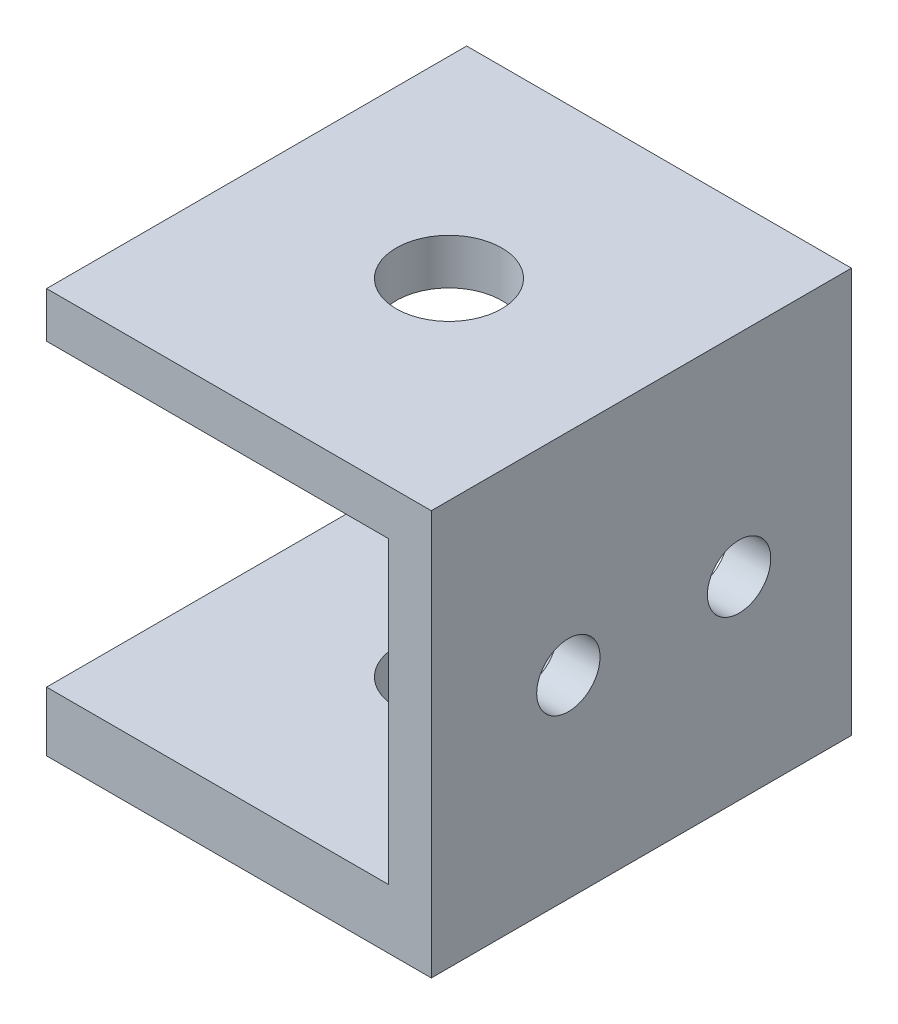
ISO-10303-21;
HEADER;
FILE_DESCRIPTION(('STEP AP214'),'2;1');
FILE_NAME('part.step','',(''),(''),'','','');
FILE_SCHEMA(('AUTOMOTIVE_DESIGN { 1 0 10303 214 1 1 1 1 }'));
ENDSEC;
DATA;
#1=APPLICATION_CONTEXT('core data for automotive mechanical design processes');
#2=APPLICATION_PROTOCOL_DEFINITION('international standard','automotive_design',2000,#1);
#3=PRODUCT_CONTEXT('',#1,'mechanical');
#4=PRODUCT('Part','Part','',(#3));
#5=PRODUCT_RELATED_PRODUCT_CATEGORY('part','',(#4));
#6=PRODUCT_DEFINITION_FORMATION('','',#4);
#7=PRODUCT_DEFINITION_CONTEXT('part definition',#1,'design');
#8=PRODUCT_DEFINITION('design','',#6,#7);
#9=PRODUCT_DEFINITION_SHAPE('','',#8);
#10=(LENGTH_UNIT() NAMED_UNIT(*) SI_UNIT(.MILLI.,.METRE.));
#11=(NAMED_UNIT(*) PLANE_ANGLE_UNIT() SI_UNIT($,.RADIAN.));
#12=(NAMED_UNIT(*) SI_UNIT($,.STERADIAN.) SOLID_ANGLE_UNIT());
#13=UNCERTAINTY_MEASURE_WITH_UNIT(LENGTH_MEASURE(1.E-05),#10,'distance_accuracy_value','');
#14=(GEOMETRIC_REPRESENTATION_CONTEXT(3) GLOBAL_UNCERTAINTY_ASSIGNED_CONTEXT((#13)) GLOBAL_UNIT_ASSIGNED_CONTEXT((#10,
#11,#12)) REPRESENTATION_CONTEXT('',''));
#15=CARTESIAN_POINT('',(0.,0.,0.));
#16=DIRECTION('',(0.,0.,1.));
#17=DIRECTION('',(1.,0.,0.));
#18=AXIS2_PLACEMENT_3D('',#15,#16,#17);
#19=CARTESIAN_POINT('',(0.,0.,50.));
#20=DIRECTION('',(1.,0.,0.));
#21=DIRECTION('',(0.,0.,-1.));
#22=AXIS2_PLACEMENT_3D('',#19,#20,#21);
#23=PLANE('',#22);
#24=DIRECTION('',(0.,-1.,0.));
#25=VECTOR('',#24,1.);
#26=CARTESIAN_POINT('',(0.,0.,0.));
#27=LINE('',#26,#25);
#28=CARTESIAN_POINT('',(0.,48.162822481859,0.));
#29=VERTEX_POINT('',#28);
#30=CARTESIAN_POINT('',(0.,42.7368445753196,0.));
#31=VERTEX_POINT('',#30);
#32=EDGE_CURVE('E132',#29,#31,#27,.T.);
#33=ORIENTED_EDGE('',*,*,#32,.T.);
#34=DIRECTION('',(0.,0.,1.));
#35=VECTOR('',#34,1.);
#36=CARTESIAN_POINT('',(0.,42.7368445753196,0.));
#37=LINE('',#36,#35);
#38=CARTESIAN_POINT('',(0.,42.7368445753196,50.));
#39=VERTEX_POINT('',#38);
#40=EDGE_CURVE('E133',#31,#39,#37,.T.);
#41=ORIENTED_EDGE('',*,*,#40,.T.);
#42=DIRECTION('',(0.,-1.,0.));
#43=VECTOR('',#42,1.);
#44=CARTESIAN_POINT('',(0.,0.,50.));
#45=LINE('',#44,#43);
#46=CARTESIAN_POINT('',(0.,48.162822481859,50.));
#47=VERTEX_POINT('',#46);
#48=EDGE_CURVE('E162',#47,#39,#45,.T.);
#49=ORIENTED_EDGE('',*,*,#48,.F.);
#50=DIRECTION('',(0.,0.,-1.));
#51=VECTOR('',#50,1.);
#52=CARTESIAN_POINT('',(0.,48.162822481859,50.));
#53=LINE('',#52,#51);
#54=EDGE_CURVE('E146',#47,#29,#53,.T.);
#55=ORIENTED_EDGE('',*,*,#54,.T.);
#56=EDGE_LOOP('',(#33,#41,#49,#55));
#57=FACE_BOUND('',#56,.T.);
#58=ADVANCED_FACE('F37',(#57),#23,.F.);
#59=CARTESIAN_POINT('',(0.,7.08707813494426,50.));
#60=VERTEX_POINT('',#59);
#61=CARTESIAN_POINT('',(0.,0.,50.));
#62=VERTEX_POINT('',#61);
#63=EDGE_CURVE('E90',#60,#62,#45,.T.);
#64=ORIENTED_EDGE('',*,*,#63,.F.);
#65=DIRECTION('',(0.,0.,1.));
#66=VECTOR('',#65,1.);
#67=CARTESIAN_POINT('',(0.,7.08707813494426,0.));
#68=LINE('',#67,#66);
#69=CARTESIAN_POINT('',(0.,7.08707813494426,0.));
#70=VERTEX_POINT('',#69);
#71=EDGE_CURVE('E116',#70,#60,#68,.T.);
#72=ORIENTED_EDGE('',*,*,#71,.F.);
#73=CARTESIAN_POINT('',(0.,0.,0.));
#74=VERTEX_POINT('',#73);
#75=EDGE_CURVE('E124',#70,#74,#27,.T.);
#76=ORIENTED_EDGE('',*,*,#75,.T.);
#77=DIRECTION('',(0.,0.,-1.));
#78=VECTOR('',#77,1.);
#79=CARTESIAN_POINT('',(0.,0.,50.));
#80=LINE('',#79,#78);
#81=EDGE_CURVE('E11',#62,#74,#80,.T.);
#82=ORIENTED_EDGE('',*,*,#81,.F.);
#83=EDGE_LOOP('',(#64,#72,#76,#82));
#84=FACE_BOUND('',#83,.T.);
#85=ADVANCED_FACE('F39',(#84),#23,.F.);
#86=CARTESIAN_POINT('',(0.,0.,50.));
#87=DIRECTION('',(0.,1.,0.));
#88=DIRECTION('',(0.,0.,1.));
#89=AXIS2_PLACEMENT_3D('',#86,#87,#88);
#90=PLANE('',#89);
#91=CARTESIAN_POINT('',(22.8955841722473,0.,25.));
#92=DIRECTION('',(0.,1.,0.));
#93=DIRECTION('',(0.,0.,1.));
#94=AXIS2_PLACEMENT_3D('',#91,#92,#93);
#95=CIRCLE('',#94,6.27714052911316);
#96=CARTESIAN_POINT('',(22.8955841722473,0.,31.2771405291132));
#97=VERTEX_POINT('',#96);
#98=EDGE_CURVE('E184',#97,#97,#95,.T.);
#99=ORIENTED_EDGE('',*,*,#98,.T.);
#100=EDGE_LOOP('',(#99));
#101=FACE_BOUND('',#100,.T.);
#102=DIRECTION('',(1.,0.,0.));
#103=VECTOR('',#102,1.);
#104=CARTESIAN_POINT('',(0.,0.,0.));
#105=LINE('',#104,#103);
#106=CARTESIAN_POINT('',(45.7911683444947,0.,0.));
#107=VERTEX_POINT('',#106);
#108=EDGE_CURVE('E131',#74,#107,#105,.T.);
#109=ORIENTED_EDGE('',*,*,#108,.T.);
#110=DIRECTION('',(0.,0.,-1.));
#111=VECTOR('',#110,1.);
#112=CARTESIAN_POINT('',(45.7911683444947,0.,50.));
#113=LINE('',#112,#111);
#114=CARTESIAN_POINT('',(45.7911683444947,0.,50.));
#115=VERTEX_POINT('',#114);
#116=EDGE_CURVE('E46',#115,#107,#113,.T.);
#117=ORIENTED_EDGE('',*,*,#116,.F.);
#118=DIRECTION('',(1.,0.,0.));
#119=VECTOR('',#118,1.);
#120=CARTESIAN_POINT('',(0.,0.,50.));
#121=LINE('',#120,#119);
#122=EDGE_CURVE('E164',#62,#115,#121,.T.);
#123=ORIENTED_EDGE('',*,*,#122,.F.);
#124=ORIENTED_EDGE('',*,*,#81,.T.);
#125=EDGE_LOOP('',(#109,#117,#123,#124));
#126=FACE_BOUND('',#125,.T.);
#127=ADVANCED_FACE('F231',(#101,#126),#90,.F.);
#128=CARTESIAN_POINT('',(45.7911683444947,0.,50.));
#129=DIRECTION('',(-1.,0.,0.));
#130=DIRECTION('',(0.,0.,1.));
#131=AXIS2_PLACEMENT_3D('',#128,#129,#130);
#132=PLANE('',#131);
#133=CARTESIAN_POINT('',(45.7911683444947,23.0591957157573,13.3722984011679));
#134=DIRECTION('',(-1.,0.,0.));
#135=DIRECTION('',(0.,0.,1.));
#136=AXIS2_PLACEMENT_3D('',#133,#134,#135);
#137=CIRCLE('',#136,3.76941974907196);
#138=CARTESIAN_POINT('',(45.7911683444947,23.0591957157573,17.1417181502398));
#139=VERTEX_POINT('',#138);
#140=EDGE_CURVE('E185',#139,#139,#137,.T.);
#141=ORIENTED_EDGE('',*,*,#140,.T.);
#142=EDGE_LOOP('',(#141));
#143=FACE_BOUND('',#142,.T.);
#144=CARTESIAN_POINT('',(45.7911683444947,23.0591957157573,33.6888319639625));
#145=DIRECTION('',(-1.,0.,0.));
#146=DIRECTION('',(0.,0.,1.));
#147=AXIS2_PLACEMENT_3D('',#144,#145,#146);
#148=CIRCLE('',#147,3.76941974907196);
#149=CARTESIAN_POINT('',(45.7911683444947,23.0591957157573,37.4582517130344));
#150=VERTEX_POINT('',#149);
#151=EDGE_CURVE('E191',#150,#150,#148,.T.);
#152=ORIENTED_EDGE('',*,*,#151,.T.);
#153=EDGE_LOOP('',(#152));
#154=FACE_BOUND('',#153,.T.);
#155=DIRECTION('',(0.,1.,0.));
#156=VECTOR('',#155,1.);
#157=CARTESIAN_POINT('',(45.7911683444947,0.,0.));
#158=LINE('',#157,#156);
#159=CARTESIAN_POINT('',(45.7911683444947,48.162822481859,0.));
#160=VERTEX_POINT('',#159);
#161=EDGE_CURVE('E143',#107,#160,#158,.T.);
#162=ORIENTED_EDGE('',*,*,#161,.T.);
#163=DIRECTION('',(0.,0.,-1.));
#164=VECTOR('',#163,1.);
#165=CARTESIAN_POINT('',(45.7911683444947,48.162822481859,50.));
#166=LINE('',#165,#164);
#167=CARTESIAN_POINT('',(45.7911683444947,48.162822481859,50.));
#168=VERTEX_POINT('',#167);
#169=EDGE_CURVE('E148',#168,#160,#166,.T.);
#170=ORIENTED_EDGE('',*,*,#169,.F.);
#171=DIRECTION('',(0.,1.,0.));
#172=VECTOR('',#171,1.);
#173=CARTESIAN_POINT('',(45.7911683444947,0.,50.));
#174=LINE('',#173,#172);
#175=EDGE_CURVE('E156',#115,#168,#174,.T.);
#176=ORIENTED_EDGE('',*,*,#175,.F.);
#177=ORIENTED_EDGE('',*,*,#116,.T.);
#178=EDGE_LOOP('',(#162,#170,#176,#177));
#179=FACE_BOUND('',#178,.T.);
#180=ADVANCED_FACE('F154',(#143,#154,#179),#132,.F.);
#181=CARTESIAN_POINT('',(0.,48.162822481859,50.));
#182=DIRECTION('',(0.,-1.,0.));
#183=DIRECTION('',(0.,0.,-1.));
#184=AXIS2_PLACEMENT_3D('',#181,#182,#183);
#185=PLANE('',#184);
#186=CARTESIAN_POINT('',(22.8955841722473,48.162822481859,25.));
#187=DIRECTION('',(0.,1.,0.));
#188=DIRECTION('',(0.,0.,1.));
#189=AXIS2_PLACEMENT_3D('',#186,#187,#188);
#190=CIRCLE('',#189,6.27714052911316);
#191=CARTESIAN_POINT('',(22.8955841722473,48.162822481859,31.2771405291132));
#192=VERTEX_POINT('',#191);
#193=EDGE_CURVE('E181',#192,#192,#190,.T.);
#194=ORIENTED_EDGE('',*,*,#193,.F.);
#195=EDGE_LOOP('',(#194));
#196=FACE_BOUND('',#195,.T.);
#197=DIRECTION('',(-1.,0.,0.));
#198=VECTOR('',#197,1.);
#199=CARTESIAN_POINT('',(0.,48.162822481859,0.));
#200=LINE('',#199,#198);
#201=EDGE_CURVE('E83',#160,#29,#200,.T.);
#202=ORIENTED_EDGE('',*,*,#201,.T.);
#203=ORIENTED_EDGE('',*,*,#54,.F.);
#204=DIRECTION('',(-1.,0.,0.));
#205=VECTOR('',#204,1.);
#206=CARTESIAN_POINT('',(0.,48.162822481859,50.));
#207=LINE('',#206,#205);
#208=EDGE_CURVE('E62',#168,#47,#207,.T.);
#209=ORIENTED_EDGE('',*,*,#208,.F.);
#210=ORIENTED_EDGE('',*,*,#169,.T.);
#211=EDGE_LOOP('',(#202,#203,#209,#210));
#212=FACE_BOUND('',#211,.T.);
#213=ADVANCED_FACE('F163',(#196,#212),#185,.F.);
#214=CARTESIAN_POINT('',(0.,0.,50.));
#215=DIRECTION('',(0.,0.,-1.));
#216=DIRECTION('',(-1.,0.,0.));
#217=AXIS2_PLACEMENT_3D('',#214,#215,#216);
#218=PLANE('',#217);
#219=ORIENTED_EDGE('',*,*,#48,.T.);
#220=DIRECTION('',(-1.,0.,0.));
#221=VECTOR('',#220,1.);
#222=CARTESIAN_POINT('',(0.,42.7368445753196,50.));
#223=LINE('',#222,#221);
#224=CARTESIAN_POINT('',(40.720467392435,42.7368445753196,50.));
#225=VERTEX_POINT('',#224);
#226=EDGE_CURVE('E120',#225,#39,#223,.T.);
#227=ORIENTED_EDGE('',*,*,#226,.F.);
#228=DIRECTION('',(0.,1.,0.));
#229=VECTOR('',#228,1.);
#230=CARTESIAN_POINT('',(40.720467392435,42.7368445753196,50.));
#231=LINE('',#230,#229);
#232=CARTESIAN_POINT('',(40.720467392435,7.08707813494426,50.));
#233=VERTEX_POINT('',#232);
#234=EDGE_CURVE('E171',#233,#225,#231,.T.);
#235=ORIENTED_EDGE('',*,*,#234,.F.);
#236=DIRECTION('',(1.,0.,0.));
#237=VECTOR('',#236,1.);
#238=CARTESIAN_POINT('',(0.,7.08707813494426,50.));
#239=LINE('',#238,#237);
#240=EDGE_CURVE('E174',#60,#233,#239,.T.);
#241=ORIENTED_EDGE('',*,*,#240,.F.);
#242=ORIENTED_EDGE('',*,*,#63,.T.);
#243=ORIENTED_EDGE('',*,*,#122,.T.);
#244=ORIENTED_EDGE('',*,*,#175,.T.);
#245=ORIENTED_EDGE('',*,*,#208,.T.);
#246=EDGE_LOOP('',(#219,#227,#235,#241,#242,#243,#244,#245));
#247=FACE_BOUND('',#246,.T.);
#248=ADVANCED_FACE('F217',(#247),#218,.F.);
#249=CARTESIAN_POINT('',(0.,0.,0.));
#250=DIRECTION('',(0.,0.,-1.));
#251=DIRECTION('',(-1.,0.,0.));
#252=AXIS2_PLACEMENT_3D('',#249,#250,#251);
#253=PLANE('',#252);
#254=DIRECTION('',(-1.,0.,0.));
#255=VECTOR('',#254,1.);
#256=CARTESIAN_POINT('',(0.,42.7368445753196,0.));
#257=LINE('',#256,#255);
#258=CARTESIAN_POINT('',(40.720467392435,42.7368445753196,0.));
#259=VERTEX_POINT('',#258);
#260=EDGE_CURVE('E126',#259,#31,#257,.T.);
#261=ORIENTED_EDGE('',*,*,#260,.T.);
#262=ORIENTED_EDGE('',*,*,#32,.F.);
#263=ORIENTED_EDGE('',*,*,#201,.F.);
#264=ORIENTED_EDGE('',*,*,#161,.F.);
#265=ORIENTED_EDGE('',*,*,#108,.F.);
#266=ORIENTED_EDGE('',*,*,#75,.F.);
#267=DIRECTION('',(1.,0.,0.));
#268=VECTOR('',#267,1.);
#269=CARTESIAN_POINT('',(0.,7.08707813494426,0.));
#270=LINE('',#269,#268);
#271=CARTESIAN_POINT('',(40.720467392435,7.08707813494426,0.));
#272=VERTEX_POINT('',#271);
#273=EDGE_CURVE('E112',#70,#272,#270,.T.);
#274=ORIENTED_EDGE('',*,*,#273,.T.);
#275=DIRECTION('',(0.,1.,0.));
#276=VECTOR('',#275,1.);
#277=CARTESIAN_POINT('',(40.720467392435,42.7368445753196,0.));
#278=LINE('',#277,#276);
#279=EDGE_CURVE('E53',#272,#259,#278,.T.);
#280=ORIENTED_EDGE('',*,*,#279,.T.);
#281=EDGE_LOOP('',(#261,#262,#263,#264,#265,#266,#274,#280));
#282=FACE_BOUND('',#281,.T.);
#283=ADVANCED_FACE('F129',(#282),#253,.T.);
#284=CARTESIAN_POINT('',(0.,42.7368445753196,0.));
#285=DIRECTION('',(0.,1.,0.));
#286=DIRECTION('',(0.,0.,1.));
#287=AXIS2_PLACEMENT_3D('',#284,#285,#286);
#288=PLANE('',#287);
#289=CARTESIAN_POINT('',(22.8955841722473,42.7368445753196,25.));
#290=DIRECTION('',(0.,1.,0.));
#291=DIRECTION('',(0.,0.,1.));
#292=AXIS2_PLACEMENT_3D('',#289,#290,#291);
#293=CIRCLE('',#292,6.27714052911316);
#294=CARTESIAN_POINT('',(22.8955841722473,42.7368445753196,31.2771405291132));
#295=VERTEX_POINT('',#294);
#296=EDGE_CURVE('E176',#295,#295,#293,.T.);
#297=ORIENTED_EDGE('',*,*,#296,.T.);
#298=EDGE_LOOP('',(#297));
#299=FACE_BOUND('',#298,.T.);
#300=ORIENTED_EDGE('',*,*,#226,.T.);
#301=ORIENTED_EDGE('',*,*,#40,.F.);
#302=ORIENTED_EDGE('',*,*,#260,.F.);
#303=DIRECTION('',(0.,0.,1.));
#304=VECTOR('',#303,1.);
#305=CARTESIAN_POINT('',(40.720467392435,42.7368445753196,0.));
#306=LINE('',#305,#304);
#307=EDGE_CURVE('E137',#259,#225,#306,.T.);
#308=ORIENTED_EDGE('',*,*,#307,.T.);
#309=EDGE_LOOP('',(#300,#301,#302,#308));
#310=FACE_BOUND('',#309,.T.);
#311=ADVANCED_FACE('F212',(#299,#310),#288,.F.);
#312=CARTESIAN_POINT('',(40.720467392435,42.7368445753196,0.));
#313=DIRECTION('',(1.,0.,0.));
#314=DIRECTION('',(0.,0.,-1.));
#315=AXIS2_PLACEMENT_3D('',#312,#313,#314);
#316=PLANE('',#315);
#317=CARTESIAN_POINT('',(40.720467392435,23.0591957157573,13.3722984011679));
#318=DIRECTION('',(-1.,0.,0.));
#319=DIRECTION('',(0.,0.,1.));
#320=AXIS2_PLACEMENT_3D('',#317,#318,#319);
#321=CIRCLE('',#320,3.76941974907196);
#322=CARTESIAN_POINT('',(40.720467392435,23.0591957157573,17.1417181502398));
#323=VERTEX_POINT('',#322);
#324=EDGE_CURVE('E194',#323,#323,#321,.T.);
#325=ORIENTED_EDGE('',*,*,#324,.F.);
#326=EDGE_LOOP('',(#325));
#327=FACE_BOUND('',#326,.T.);
#328=CARTESIAN_POINT('',(40.720467392435,23.0591957157573,33.6888319639625));
#329=DIRECTION('',(-1.,0.,0.));
#330=DIRECTION('',(0.,0.,1.));
#331=AXIS2_PLACEMENT_3D('',#328,#329,#330);
#332=CIRCLE('',#331,3.76941974907196);
#333=CARTESIAN_POINT('',(40.720467392435,23.0591957157573,37.4582517130344));
#334=VERTEX_POINT('',#333);
#335=EDGE_CURVE('E188',#334,#334,#332,.T.);
#336=ORIENTED_EDGE('',*,*,#335,.F.);
#337=EDGE_LOOP('',(#336));
#338=FACE_BOUND('',#337,.T.);
#339=ORIENTED_EDGE('',*,*,#234,.T.);
#340=ORIENTED_EDGE('',*,*,#307,.F.);
#341=ORIENTED_EDGE('',*,*,#279,.F.);
#342=DIRECTION('',(0.,0.,1.));
#343=VECTOR('',#342,1.);
#344=CARTESIAN_POINT('',(40.720467392435,7.08707813494426,0.));
#345=LINE('',#344,#343);
#346=EDGE_CURVE('E117',#272,#233,#345,.T.);
#347=ORIENTED_EDGE('',*,*,#346,.T.);
#348=EDGE_LOOP('',(#339,#340,#341,#347));
#349=FACE_BOUND('',#348,.T.);
#350=ADVANCED_FACE('F209',(#327,#338,#349),#316,.F.);
#351=CARTESIAN_POINT('',(0.,7.08707813494426,0.));
#352=DIRECTION('',(0.,-1.,0.));
#353=DIRECTION('',(0.,0.,-1.));
#354=AXIS2_PLACEMENT_3D('',#351,#352,#353);
#355=PLANE('',#354);
#356=CARTESIAN_POINT('',(22.8955841722473,7.08707813494426,25.));
#357=DIRECTION('',(0.,-1.,0.));
#358=DIRECTION('',(0.,0.,-1.));
#359=AXIS2_PLACEMENT_3D('',#356,#357,#358);
#360=CIRCLE('',#359,6.27714052911316);
#361=CARTESIAN_POINT('',(22.8955841722473,7.08707813494426,18.7228594708868));
#362=VERTEX_POINT('',#361);
#363=EDGE_CURVE('E41',#362,#362,#360,.T.);
#364=ORIENTED_EDGE('',*,*,#363,.T.);
#365=EDGE_LOOP('',(#364));
#366=FACE_BOUND('',#365,.T.);
#367=ORIENTED_EDGE('',*,*,#240,.T.);
#368=ORIENTED_EDGE('',*,*,#346,.F.);
#369=ORIENTED_EDGE('',*,*,#273,.F.);
#370=ORIENTED_EDGE('',*,*,#71,.T.);
#371=EDGE_LOOP('',(#367,#368,#369,#370));
#372=FACE_BOUND('',#371,.T.);
#373=ADVANCED_FACE('F115',(#366,#372),#355,.F.);
#374=CARTESIAN_POINT('',(22.8955841722473,0.,25.));
#375=DIRECTION('',(0.,1.,0.));
#376=DIRECTION('',(0.,0.,1.));
#377=AXIS2_PLACEMENT_3D('',#374,#375,#376);
#378=CYLINDRICAL_SURFACE('',#377,6.27714052911316);
#379=ORIENTED_EDGE('',*,*,#98,.F.);
#380=EDGE_LOOP('',(#379));
#381=FACE_BOUND('',#380,.T.);
#382=ORIENTED_EDGE('',*,*,#363,.F.);
#383=EDGE_LOOP('',(#382));
#384=FACE_BOUND('',#383,.T.);
#385=ADVANCED_FACE('F247',(#381,#384),#378,.F.);
#386=ORIENTED_EDGE('',*,*,#193,.T.);
#387=EDGE_LOOP('',(#386));
#388=FACE_BOUND('',#387,.T.);
#389=ORIENTED_EDGE('',*,*,#296,.F.);
#390=EDGE_LOOP('',(#389));
#391=FACE_BOUND('',#390,.T.);
#392=ADVANCED_FACE('F252',(#388,#391),#378,.F.);
#393=CARTESIAN_POINT('',(45.7911683444947,23.0591957157573,33.6888319639625));
#394=DIRECTION('',(-1.,0.,0.));
#395=DIRECTION('',(0.,0.,1.));
#396=AXIS2_PLACEMENT_3D('',#393,#394,#395);
#397=CYLINDRICAL_SURFACE('',#396,3.76941974907196);
#398=CARTESIAN_POINT('',(45.7911683444947,23.0591957157573,37.4582517130344));
#399=CARTESIAN_POINT('',(45.7383485429107,23.0591957157573,37.4582517130344));
#400=CARTESIAN_POINT('',(45.6855287413268,23.0591957157573,37.4582517130344));
#401=CARTESIAN_POINT('',(45.5798891381589,23.0591957157573,37.4582517130344));
#402=CARTESIAN_POINT('',(45.5270693365749,23.0591957157573,37.4582517130344));
#403=CARTESIAN_POINT('',(45.421429733407,23.0591957157573,37.4582517130344));
#404=CARTESIAN_POINT('',(45.368609931823,23.0591957157573,37.4582517130344));
#405=CARTESIAN_POINT('',(45.2629703286551,23.0591957157573,37.4582517130344));
#406=CARTESIAN_POINT('',(45.2101505270712,23.0591957157573,37.4582517130344));
#407=CARTESIAN_POINT('',(45.1045109239033,23.0591957157573,37.4582517130344));
#408=CARTESIAN_POINT('',(45.0516911223193,23.0591957157573,37.4582517130344));
#409=CARTESIAN_POINT('',(44.9460515191514,23.0591957157573,37.4582517130344));
#410=CARTESIAN_POINT('',(44.8932317175674,23.0591957157573,37.4582517130344));
#411=CARTESIAN_POINT('',(44.7875921143995,23.0591957157573,37.4582517130344));
#412=CARTESIAN_POINT('',(44.7347723128156,23.0591957157573,37.4582517130344));
#413=CARTESIAN_POINT('',(44.6291327096477,23.0591957157573,37.4582517130344));
#414=CARTESIAN_POINT('',(44.5763129080637,23.0591957157573,37.4582517130344));
#415=CARTESIAN_POINT('',(44.4706733048958,23.0591957157573,37.4582517130344));
#416=CARTESIAN_POINT('',(44.4178535033119,23.0591957157573,37.4582517130344));
#417=CARTESIAN_POINT('',(44.3122139001439,23.0591957157573,37.4582517130344));
#418=CARTESIAN_POINT('',(44.25939409856,23.0591957157573,37.4582517130344));
#419=CARTESIAN_POINT('',(44.1537544953921,23.0591957157573,37.4582517130344));
#420=CARTESIAN_POINT('',(44.1009346938081,23.0591957157573,37.4582517130344));
#421=CARTESIAN_POINT('',(43.9952950906402,23.0591957157573,37.4582517130344));
#422=CARTESIAN_POINT('',(43.9424752890563,23.0591957157573,37.4582517130344));
#423=CARTESIAN_POINT('',(43.8368356858884,23.0591957157573,37.4582517130344));
#424=CARTESIAN_POINT('',(43.7840158843044,23.0591957157573,37.4582517130344));
#425=CARTESIAN_POINT('',(43.6783762811365,23.0591957157573,37.4582517130344));
#426=CARTESIAN_POINT('',(43.6255564795525,23.0591957157573,37.4582517130344));
#427=CARTESIAN_POINT('',(43.5199168763846,23.0591957157573,37.4582517130344));
#428=CARTESIAN_POINT('',(43.4670970748007,23.0591957157573,37.4582517130344));
#429=CARTESIAN_POINT('',(43.3614574716328,23.0591957157573,37.4582517130344));
#430=CARTESIAN_POINT('',(43.3086376700488,23.0591957157573,37.4582517130344));
#431=CARTESIAN_POINT('',(43.2029980668809,23.0591957157573,37.4582517130344));
#432=CARTESIAN_POINT('',(43.150178265297,23.0591957157573,37.4582517130344));
#433=CARTESIAN_POINT('',(43.044538662129,23.0591957157573,37.4582517130344));
#434=CARTESIAN_POINT('',(42.9917188605451,23.0591957157573,37.4582517130344));
#435=CARTESIAN_POINT('',(42.8860792573772,23.0591957157573,37.4582517130344));
#436=CARTESIAN_POINT('',(42.8332594557932,23.0591957157573,37.4582517130344));
#437=CARTESIAN_POINT('',(42.7276198526253,23.0591957157573,37.4582517130344));
#438=CARTESIAN_POINT('',(42.6748000510414,23.0591957157573,37.4582517130344));
#439=CARTESIAN_POINT('',(42.5691604478735,23.0591957157573,37.4582517130344));
#440=CARTESIAN_POINT('',(42.5163406462895,23.0591957157573,37.4582517130344));
#441=CARTESIAN_POINT('',(42.4107010431216,23.0591957157573,37.4582517130344));
#442=CARTESIAN_POINT('',(42.3578812415376,23.0591957157573,37.4582517130344));
#443=CARTESIAN_POINT('',(42.2522416383697,23.0591957157573,37.4582517130344));
#444=CARTESIAN_POINT('',(42.1994218367858,23.0591957157573,37.4582517130344));
#445=CARTESIAN_POINT('',(42.0937822336179,23.0591957157573,37.4582517130344));
#446=CARTESIAN_POINT('',(42.0409624320339,23.0591957157573,37.4582517130344));
#447=CARTESIAN_POINT('',(41.935322828866,23.0591957157573,37.4582517130344));
#448=CARTESIAN_POINT('',(41.882503027282,23.0591957157573,37.4582517130344));
#449=CARTESIAN_POINT('',(41.7768634241141,23.0591957157573,37.4582517130344));
#450=CARTESIAN_POINT('',(41.7240436225302,23.0591957157573,37.4582517130344));
#451=CARTESIAN_POINT('',(41.6184040193623,23.0591957157573,37.4582517130344));
#452=CARTESIAN_POINT('',(41.5655842177783,23.0591957157573,37.4582517130344));
#453=CARTESIAN_POINT('',(41.4599446146104,23.0591957157573,37.4582517130344));
#454=CARTESIAN_POINT('',(41.4071248130264,23.0591957157573,37.4582517130344));
#455=CARTESIAN_POINT('',(41.3014852098585,23.0591957157573,37.4582517130344));
#456=CARTESIAN_POINT('',(41.2486654082746,23.0591957157573,37.4582517130344));
#457=CARTESIAN_POINT('',(41.1430258051067,23.0591957157573,37.4582517130344));
#458=CARTESIAN_POINT('',(41.0902060035227,23.0591957157573,37.4582517130344));
#459=CARTESIAN_POINT('',(40.9845664003548,23.0591957157573,37.4582517130344));
#460=CARTESIAN_POINT('',(40.9317465987709,23.0591957157573,37.4582517130344));
#461=CARTESIAN_POINT('',(40.8261069956029,23.0591957157573,37.4582517130344));
#462=CARTESIAN_POINT('',(40.773287194019,23.0591957157573,37.4582517130344));
#463=CARTESIAN_POINT('',(40.720467392435,23.0591957157573,37.4582517130344));
#464=B_SPLINE_CURVE_WITH_KNOTS('',3,(#398,#399,#400,#401,#402,#403,#404,#405,#406,#407,#408,
#409,#410,#411,#412,#413,#414,#415,#416,#417,#418,#419,#420,#421,#422,#423,#424,#425,#426,#427,
#428,#429,#430,#431,#432,#433,#434,#435,#436,#437,#438,#439,#440,#441,#442,#443,#444,#445,#446,
#447,#448,#449,#450,#451,#452,#453,#454,#455,#456,#457,#458,#459,#460,#461,#462,#463),
.UNSPECIFIED.,.F.,.F.,(4,2,2,2,2,2,2,2,2,2,2,2,2,2,2,2,2,2,2,2,2,2,2,2,2,2,2,2,2,2,2,2,4),(0.,
0.158459404751864,0.316918809503727,0.475378214255591,0.633837619007455,0.792297023759318,
0.950756428511182,1.10921583326305,1.26767523801491,1.42613464276677,1.58459404751864,
1.7430534522705,1.90151285702236,2.05997226177423,2.21843166652609,2.37689107127795,
2.53535047602982,2.69380988078168,2.85226928553355,3.01072869028541,3.16918809503727,
3.32764749978914,3.486106904541,3.64456630929286,3.80302571404473,3.96148511879659,
4.11994452354845,4.27840392830032,4.43686333305218,4.59532273780405,4.75378214255591,
4.91224154730778,5.07070095205964),.UNSPECIFIED.);
#465=EDGE_CURVE('BSEAM205',#150,#334,#464,.T.);
#466=ORIENTED_EDGE('',*,*,#151,.F.);
#467=ORIENTED_EDGE('',*,*,#335,.T.);
#468=ORIENTED_EDGE('',*,*,#465,.T.);
#469=ORIENTED_EDGE('',*,*,#465,.F.);
#470=EDGE_LOOP('',(#466,#468,#467,#469));
#471=FACE_BOUND('',#470,.T.);
#472=ADVANCED_FACE('F205',(#471),#397,.F.);
#473=CARTESIAN_POINT('',(45.7911683444947,23.0591957157573,13.3722984011679));
#474=DIRECTION('',(-1.,0.,0.));
#475=DIRECTION('',(0.,0.,1.));
#476=AXIS2_PLACEMENT_3D('',#473,#474,#475);
#477=CYLINDRICAL_SURFACE('',#476,3.76941974907196);
#478=CARTESIAN_POINT('',(45.7911683444947,23.0591957157573,17.1417181502398));
#479=CARTESIAN_POINT('',(45.7383485429107,23.0591957157573,17.1417181502398));
#480=CARTESIAN_POINT('',(45.6855287413268,23.0591957157573,17.1417181502398));
#481=CARTESIAN_POINT('',(45.5798891381589,23.0591957157573,17.1417181502398));
#482=CARTESIAN_POINT('',(45.5270693365749,23.0591957157573,17.1417181502398));
#483=CARTESIAN_POINT('',(45.421429733407,23.0591957157573,17.1417181502398));
#484=CARTESIAN_POINT('',(45.368609931823,23.0591957157573,17.1417181502398));
#485=CARTESIAN_POINT('',(45.2629703286551,23.0591957157573,17.1417181502398));
#486=CARTESIAN_POINT('',(45.2101505270712,23.0591957157573,17.1417181502398));
#487=CARTESIAN_POINT('',(45.1045109239033,23.0591957157573,17.1417181502398));
#488=CARTESIAN_POINT('',(45.0516911223193,23.0591957157573,17.1417181502398));
#489=CARTESIAN_POINT('',(44.9460515191514,23.0591957157573,17.1417181502398));
#490=CARTESIAN_POINT('',(44.8932317175674,23.0591957157573,17.1417181502398));
#491=CARTESIAN_POINT('',(44.7875921143995,23.0591957157573,17.1417181502398));
#492=CARTESIAN_POINT('',(44.7347723128156,23.0591957157573,17.1417181502398));
#493=CARTESIAN_POINT('',(44.6291327096477,23.0591957157573,17.1417181502398));
#494=CARTESIAN_POINT('',(44.5763129080637,23.0591957157573,17.1417181502398));
#495=CARTESIAN_POINT('',(44.4706733048958,23.0591957157573,17.1417181502398));
#496=CARTESIAN_POINT('',(44.4178535033119,23.0591957157573,17.1417181502398));
#497=CARTESIAN_POINT('',(44.3122139001439,23.0591957157573,17.1417181502398));
#498=CARTESIAN_POINT('',(44.25939409856,23.0591957157573,17.1417181502398));
#499=CARTESIAN_POINT('',(44.1537544953921,23.0591957157573,17.1417181502398));
#500=CARTESIAN_POINT('',(44.1009346938081,23.0591957157573,17.1417181502398));
#501=CARTESIAN_POINT('',(43.9952950906402,23.0591957157573,17.1417181502398));
#502=CARTESIAN_POINT('',(43.9424752890563,23.0591957157573,17.1417181502398));
#503=CARTESIAN_POINT('',(43.8368356858884,23.0591957157573,17.1417181502398));
#504=CARTESIAN_POINT('',(43.7840158843044,23.0591957157573,17.1417181502398));
#505=CARTESIAN_POINT('',(43.6783762811365,23.0591957157573,17.1417181502398));
#506=CARTESIAN_POINT('',(43.6255564795525,23.0591957157573,17.1417181502398));
#507=CARTESIAN_POINT('',(43.5199168763846,23.0591957157573,17.1417181502398));
#508=CARTESIAN_POINT('',(43.4670970748007,23.0591957157573,17.1417181502398));
#509=CARTESIAN_POINT('',(43.3614574716328,23.0591957157573,17.1417181502398));
#510=CARTESIAN_POINT('',(43.3086376700488,23.0591957157573,17.1417181502398));
#511=CARTESIAN_POINT('',(43.2029980668809,23.0591957157573,17.1417181502398));
#512=CARTESIAN_POINT('',(43.150178265297,23.0591957157573,17.1417181502398));
#513=CARTESIAN_POINT('',(43.044538662129,23.0591957157573,17.1417181502398));
#514=CARTESIAN_POINT('',(42.9917188605451,23.0591957157573,17.1417181502398));
#515=CARTESIAN_POINT('',(42.8860792573772,23.0591957157573,17.1417181502398));
#516=CARTESIAN_POINT('',(42.8332594557932,23.0591957157573,17.1417181502398));
#517=CARTESIAN_POINT('',(42.7276198526253,23.0591957157573,17.1417181502398));
#518=CARTESIAN_POINT('',(42.6748000510414,23.0591957157573,17.1417181502398));
#519=CARTESIAN_POINT('',(42.5691604478735,23.0591957157573,17.1417181502398));
#520=CARTESIAN_POINT('',(42.5163406462895,23.0591957157573,17.1417181502398));
#521=CARTESIAN_POINT('',(42.4107010431216,23.0591957157573,17.1417181502398));
#522=CARTESIAN_POINT('',(42.3578812415376,23.0591957157573,17.1417181502398));
#523=CARTESIAN_POINT('',(42.2522416383697,23.0591957157573,17.1417181502398));
#524=CARTESIAN_POINT('',(42.1994218367858,23.0591957157573,17.1417181502398));
#525=CARTESIAN_POINT('',(42.0937822336179,23.0591957157573,17.1417181502398));
#526=CARTESIAN_POINT('',(42.0409624320339,23.0591957157573,17.1417181502398));
#527=CARTESIAN_POINT('',(41.935322828866,23.0591957157573,17.1417181502398));
#528=CARTESIAN_POINT('',(41.882503027282,23.0591957157573,17.1417181502398));
#529=CARTESIAN_POINT('',(41.7768634241141,23.0591957157573,17.1417181502398));
#530=CARTESIAN_POINT('',(41.7240436225302,23.0591957157573,17.1417181502398));
#531=CARTESIAN_POINT('',(41.6184040193623,23.0591957157573,17.1417181502398));
#532=CARTESIAN_POINT('',(41.5655842177783,23.0591957157573,17.1417181502398));
#533=CARTESIAN_POINT('',(41.4599446146104,23.0591957157573,17.1417181502398));
#534=CARTESIAN_POINT('',(41.4071248130264,23.0591957157573,17.1417181502398));
#535=CARTESIAN_POINT('',(41.3014852098585,23.0591957157573,17.1417181502398));
#536=CARTESIAN_POINT('',(41.2486654082746,23.0591957157573,17.1417181502398));
#537=CARTESIAN_POINT('',(41.1430258051067,23.0591957157573,17.1417181502398));
#538=CARTESIAN_POINT('',(41.0902060035227,23.0591957157573,17.1417181502398));
#539=CARTESIAN_POINT('',(40.9845664003548,23.0591957157573,17.1417181502398));
#540=CARTESIAN_POINT('',(40.9317465987709,23.0591957157573,17.1417181502398));
#541=CARTESIAN_POINT('',(40.8261069956029,23.0591957157573,17.1417181502398));
#542=CARTESIAN_POINT('',(40.773287194019,23.0591957157573,17.1417181502398));
#543=CARTESIAN_POINT('',(40.720467392435,23.0591957157573,17.1417181502398));
#544=B_SPLINE_CURVE_WITH_KNOTS('',3,(#478,#479,#480,#481,#482,#483,#484,#485,#486,#487,#488,
#489,#490,#491,#492,#493,#494,#495,#496,#497,#498,#499,#500,#501,#502,#503,#504,#505,#506,#507,
#508,#509,#510,#511,#512,#513,#514,#515,#516,#517,#518,#519,#520,#521,#522,#523,#524,#525,#526,
#527,#528,#529,#530,#531,#532,#533,#534,#535,#536,#537,#538,#539,#540,#541,#542,#543),
.UNSPECIFIED.,.F.,.F.,(4,2,2,2,2,2,2,2,2,2,2,2,2,2,2,2,2,2,2,2,2,2,2,2,2,2,2,2,2,2,2,2,4),(0.,
0.158459404751864,0.316918809503727,0.475378214255591,0.633837619007455,0.792297023759318,
0.950756428511182,1.10921583326305,1.26767523801491,1.42613464276677,1.58459404751864,
1.7430534522705,1.90151285702236,2.05997226177423,2.21843166652609,2.37689107127795,
2.53535047602982,2.69380988078168,2.85226928553355,3.01072869028541,3.16918809503727,
3.32764749978914,3.486106904541,3.64456630929286,3.80302571404473,3.96148511879659,
4.11994452354845,4.27840392830032,4.43686333305218,4.59532273780405,4.75378214255591,
4.91224154730778,5.07070095205964),.UNSPECIFIED.);
#545=EDGE_CURVE('BSEAM202',#139,#323,#544,.T.);
#546=ORIENTED_EDGE('',*,*,#140,.F.);
#547=ORIENTED_EDGE('',*,*,#324,.T.);
#548=ORIENTED_EDGE('',*,*,#545,.T.);
#549=ORIENTED_EDGE('',*,*,#545,.F.);
#550=EDGE_LOOP('',(#546,#548,#547,#549));
#551=FACE_BOUND('',#550,.T.);
#552=ADVANCED_FACE('F202',(#551),#477,.F.);
#553=CLOSED_SHELL('',(#58,#85,#127,#180,#213,#248,#283,#311,#350,#373,#385,#392,#472,#552));
#554=MANIFOLD_SOLID_BREP('B2',#553);
#555=ADVANCED_BREP_SHAPE_REPRESENTATION('',(#18,#554),#14);
#556=SHAPE_DEFINITION_REPRESENTATION(#9,#555);
ENDSEC;
END-ISO-10303-21;
